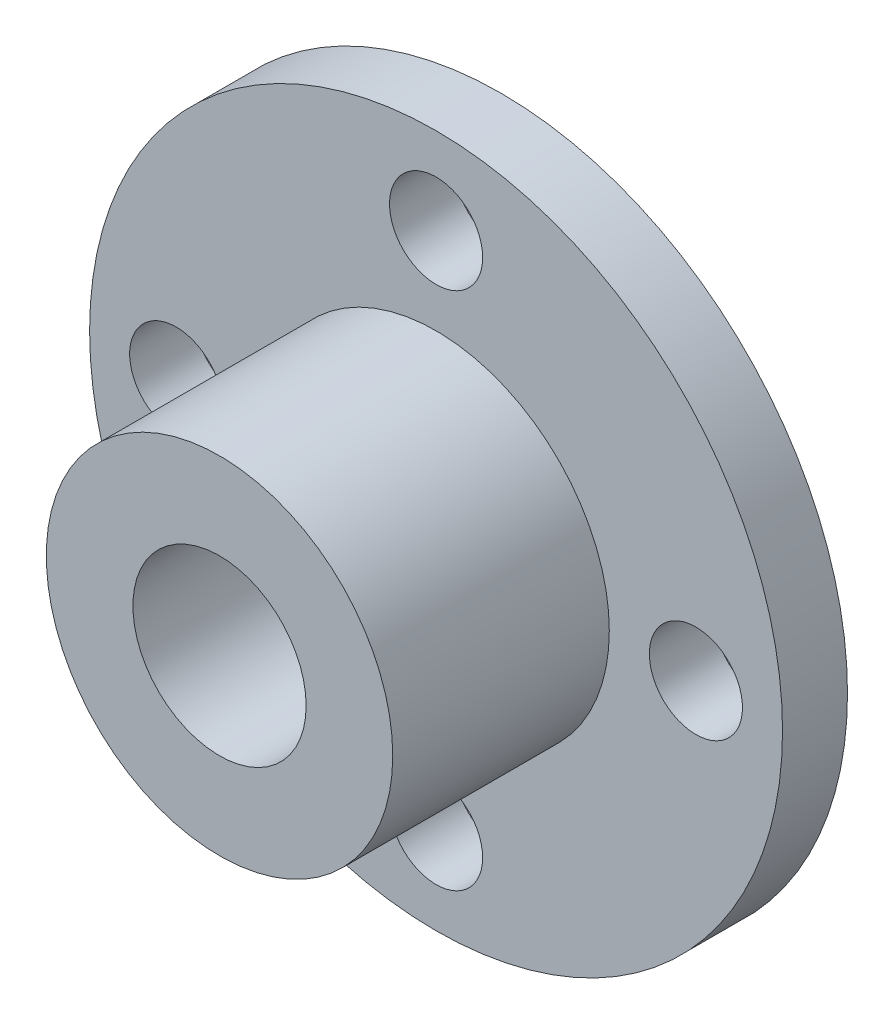
ISO-10303-21;
HEADER;
FILE_DESCRIPTION(('STEP AP214'),'2;1');
FILE_NAME('part.step','',(''),(''),'','','');
FILE_SCHEMA(('AUTOMOTIVE_DESIGN { 1 0 10303 214 1 1 1 1 }'));
ENDSEC;
DATA;
#1=APPLICATION_CONTEXT('core data for automotive mechanical design processes');
#2=APPLICATION_PROTOCOL_DEFINITION('international standard','automotive_design',2000,#1);
#3=PRODUCT_CONTEXT('',#1,'mechanical');
#4=PRODUCT('Part','Part','',(#3));
#5=PRODUCT_RELATED_PRODUCT_CATEGORY('part','',(#4));
#6=PRODUCT_DEFINITION_FORMATION('','',#4);
#7=PRODUCT_DEFINITION_CONTEXT('part definition',#1,'design');
#8=PRODUCT_DEFINITION('design','',#6,#7);
#9=PRODUCT_DEFINITION_SHAPE('','',#8);
#10=(LENGTH_UNIT() NAMED_UNIT(*) SI_UNIT(.MILLI.,.METRE.));
#11=(NAMED_UNIT(*) PLANE_ANGLE_UNIT() SI_UNIT($,.RADIAN.));
#12=(NAMED_UNIT(*) SI_UNIT($,.STERADIAN.) SOLID_ANGLE_UNIT());
#13=UNCERTAINTY_MEASURE_WITH_UNIT(LENGTH_MEASURE(1.E-05),#10,'distance_accuracy_value','');
#14=(GEOMETRIC_REPRESENTATION_CONTEXT(3) GLOBAL_UNCERTAINTY_ASSIGNED_CONTEXT((#13)) GLOBAL_UNIT_ASSIGNED_CONTEXT((#10,
#11,#12)) REPRESENTATION_CONTEXT('',''));
#15=CARTESIAN_POINT('',(0.,0.,0.));
#16=DIRECTION('',(0.,0.,1.));
#17=DIRECTION('',(1.,0.,0.));
#18=AXIS2_PLACEMENT_3D('',#15,#16,#17);
#19=CARTESIAN_POINT('',(0.,12.,3.));
#20=DIRECTION('',(0.,0.,-1.));
#21=DIRECTION('',(-1.,0.,0.));
#22=AXIS2_PLACEMENT_3D('',#19,#20,#21);
#23=CYLINDRICAL_SURFACE('',#22,2.15);
#24=CARTESIAN_POINT('',(0.,12.,3.));
#25=DIRECTION('',(0.,0.,1.));
#26=DIRECTION('',(1.,0.,0.));
#27=AXIS2_PLACEMENT_3D('',#24,#25,#26);
#28=CIRCLE('',#27,2.15);
#29=CARTESIAN_POINT('',(2.15,12.,3.));
#30=VERTEX_POINT('',#29);
#31=EDGE_CURVE('E44',#30,#30,#28,.T.);
#32=ORIENTED_EDGE('',*,*,#31,.T.);
#33=EDGE_LOOP('',(#32));
#34=FACE_BOUND('',#33,.T.);
#35=CARTESIAN_POINT('',(0.,12.,0.));
#36=DIRECTION('',(0.,0.,1.));
#37=DIRECTION('',(1.,0.,0.));
#38=AXIS2_PLACEMENT_3D('',#35,#36,#37);
#39=CIRCLE('',#38,2.15);
#40=CARTESIAN_POINT('',(2.15,12.,0.));
#41=VERTEX_POINT('',#40);
#42=EDGE_CURVE('E63',#41,#41,#39,.T.);
#43=ORIENTED_EDGE('',*,*,#42,.F.);
#44=EDGE_LOOP('',(#43));
#45=FACE_BOUND('',#44,.T.);
#46=ADVANCED_FACE('F33',(#34,#45),#23,.F.);
#47=CARTESIAN_POINT('',(0.,-12.,3.));
#48=DIRECTION('',(0.,0.,-1.));
#49=DIRECTION('',(-1.,0.,0.));
#50=AXIS2_PLACEMENT_3D('',#47,#48,#49);
#51=CYLINDRICAL_SURFACE('',#50,2.15);
#52=CARTESIAN_POINT('',(0.,-12.,3.));
#53=DIRECTION('',(0.,0.,1.));
#54=DIRECTION('',(1.,0.,0.));
#55=AXIS2_PLACEMENT_3D('',#52,#53,#54);
#56=CIRCLE('',#55,2.15);
#57=CARTESIAN_POINT('',(2.15,-12.,3.));
#58=VERTEX_POINT('',#57);
#59=EDGE_CURVE('E49',#58,#58,#56,.T.);
#60=ORIENTED_EDGE('',*,*,#59,.T.);
#61=EDGE_LOOP('',(#60));
#62=FACE_BOUND('',#61,.T.);
#63=CARTESIAN_POINT('',(0.,-12.,0.));
#64=DIRECTION('',(0.,0.,1.));
#65=DIRECTION('',(1.,0.,0.));
#66=AXIS2_PLACEMENT_3D('',#63,#64,#65);
#67=CIRCLE('',#66,2.15);
#68=CARTESIAN_POINT('',(2.15,-12.,0.));
#69=VERTEX_POINT('',#68);
#70=EDGE_CURVE('E60',#69,#69,#67,.T.);
#71=ORIENTED_EDGE('',*,*,#70,.F.);
#72=EDGE_LOOP('',(#71));
#73=FACE_BOUND('',#72,.T.);
#74=ADVANCED_FACE('F83',(#62,#73),#51,.F.);
#75=CARTESIAN_POINT('',(-12.,0.,3.));
#76=DIRECTION('',(0.,0.,-1.));
#77=DIRECTION('',(-1.,0.,0.));
#78=AXIS2_PLACEMENT_3D('',#75,#76,#77);
#79=CYLINDRICAL_SURFACE('',#78,2.15);
#80=CARTESIAN_POINT('',(-12.,0.,3.));
#81=DIRECTION('',(0.,0.,1.));
#82=DIRECTION('',(1.,0.,0.));
#83=AXIS2_PLACEMENT_3D('',#80,#81,#82);
#84=CIRCLE('',#83,2.15);
#85=CARTESIAN_POINT('',(-9.85,0.,3.));
#86=VERTEX_POINT('',#85);
#87=EDGE_CURVE('E71',#86,#86,#84,.T.);
#88=ORIENTED_EDGE('',*,*,#87,.T.);
#89=EDGE_LOOP('',(#88));
#90=FACE_BOUND('',#89,.T.);
#91=CARTESIAN_POINT('',(-12.,0.,0.));
#92=DIRECTION('',(0.,0.,1.));
#93=DIRECTION('',(1.,0.,0.));
#94=AXIS2_PLACEMENT_3D('',#91,#92,#93);
#95=CIRCLE('',#94,2.15);
#96=CARTESIAN_POINT('',(-9.85,0.,0.));
#97=VERTEX_POINT('',#96);
#98=EDGE_CURVE('E56',#97,#97,#95,.T.);
#99=ORIENTED_EDGE('',*,*,#98,.F.);
#100=EDGE_LOOP('',(#99));
#101=FACE_BOUND('',#100,.T.);
#102=ADVANCED_FACE('F119',(#90,#101),#79,.F.);
#103=CARTESIAN_POINT('',(12.,0.,3.));
#104=DIRECTION('',(0.,0.,-1.));
#105=DIRECTION('',(-1.,0.,0.));
#106=AXIS2_PLACEMENT_3D('',#103,#104,#105);
#107=CYLINDRICAL_SURFACE('',#106,2.15);
#108=CARTESIAN_POINT('',(12.,0.,3.));
#109=DIRECTION('',(0.,0.,1.));
#110=DIRECTION('',(1.,0.,0.));
#111=AXIS2_PLACEMENT_3D('',#108,#109,#110);
#112=CIRCLE('',#111,2.15);
#113=CARTESIAN_POINT('',(14.15,0.,3.));
#114=VERTEX_POINT('',#113);
#115=EDGE_CURVE('E67',#114,#114,#112,.T.);
#116=ORIENTED_EDGE('',*,*,#115,.T.);
#117=EDGE_LOOP('',(#116));
#118=FACE_BOUND('',#117,.T.);
#119=CARTESIAN_POINT('',(12.,0.,0.));
#120=DIRECTION('',(0.,0.,1.));
#121=DIRECTION('',(1.,0.,0.));
#122=AXIS2_PLACEMENT_3D('',#119,#120,#121);
#123=CIRCLE('',#122,2.15);
#124=CARTESIAN_POINT('',(14.15,0.,0.));
#125=VERTEX_POINT('',#124);
#126=EDGE_CURVE('E53',#125,#125,#123,.T.);
#127=ORIENTED_EDGE('',*,*,#126,.F.);
#128=EDGE_LOOP('',(#127));
#129=FACE_BOUND('',#128,.T.);
#130=ADVANCED_FACE('F35',(#118,#129),#107,.F.);
#131=CARTESIAN_POINT('',(0.,0.,3.));
#132=DIRECTION('',(0.,0.,-1.));
#133=DIRECTION('',(-1.,0.,0.));
#134=AXIS2_PLACEMENT_3D('',#131,#132,#133);
#135=CYLINDRICAL_SURFACE('',#134,16.);
#136=CARTESIAN_POINT('',(0.,0.,3.));
#137=DIRECTION('',(0.,0.,1.));
#138=DIRECTION('',(1.,0.,0.));
#139=AXIS2_PLACEMENT_3D('',#136,#137,#138);
#140=CIRCLE('',#139,16.);
#141=CARTESIAN_POINT('',(16.,0.,3.));
#142=VERTEX_POINT('',#141);
#143=EDGE_CURVE('E40',#142,#142,#140,.T.);
#144=ORIENTED_EDGE('',*,*,#143,.F.);
#145=EDGE_LOOP('',(#144));
#146=FACE_BOUND('',#145,.T.);
#147=CARTESIAN_POINT('',(0.,0.,0.));
#148=DIRECTION('',(0.,0.,1.));
#149=DIRECTION('',(1.,0.,0.));
#150=AXIS2_PLACEMENT_3D('',#147,#148,#149);
#151=CIRCLE('',#150,16.);
#152=CARTESIAN_POINT('',(16.,0.,0.));
#153=VERTEX_POINT('',#152);
#154=EDGE_CURVE('E65',#153,#153,#151,.T.);
#155=ORIENTED_EDGE('',*,*,#154,.T.);
#156=EDGE_LOOP('',(#155));
#157=FACE_BOUND('',#156,.T.);
#158=ADVANCED_FACE('F90',(#146,#157),#135,.T.);
#159=CARTESIAN_POINT('',(0.,0.,3.));
#160=DIRECTION('',(0.,0.,1.));
#161=DIRECTION('',(1.,0.,0.));
#162=AXIS2_PLACEMENT_3D('',#159,#160,#161);
#163=PLANE('',#162);
#164=CARTESIAN_POINT('',(0.,0.,3.));
#165=DIRECTION('',(0.,0.,1.));
#166=DIRECTION('',(1.,0.,0.));
#167=AXIS2_PLACEMENT_3D('',#164,#165,#166);
#168=CIRCLE('',#167,8.);
#169=CARTESIAN_POINT('',(8.,0.,3.));
#170=VERTEX_POINT('',#169);
#171=EDGE_CURVE('E78',#170,#170,#168,.T.);
#172=ORIENTED_EDGE('',*,*,#171,.F.);
#173=EDGE_LOOP('',(#172));
#174=FACE_BOUND('',#173,.T.);
#175=ORIENTED_EDGE('',*,*,#115,.F.);
#176=EDGE_LOOP('',(#175));
#177=FACE_BOUND('',#176,.T.);
#178=ORIENTED_EDGE('',*,*,#87,.F.);
#179=EDGE_LOOP('',(#178));
#180=FACE_BOUND('',#179,.T.);
#181=ORIENTED_EDGE('',*,*,#59,.F.);
#182=EDGE_LOOP('',(#181));
#183=FACE_BOUND('',#182,.T.);
#184=ORIENTED_EDGE('',*,*,#31,.F.);
#185=EDGE_LOOP('',(#184));
#186=FACE_BOUND('',#185,.T.);
#187=ORIENTED_EDGE('',*,*,#143,.T.);
#188=EDGE_LOOP('',(#187));
#189=FACE_BOUND('',#188,.T.);
#190=ADVANCED_FACE('F86',(#174,#177,#180,#183,#186,#189),#163,.T.);
#191=CARTESIAN_POINT('',(0.,0.,0.));
#192=DIRECTION('',(0.,0.,1.));
#193=DIRECTION('',(1.,0.,0.));
#194=AXIS2_PLACEMENT_3D('',#191,#192,#193);
#195=PLANE('',#194);
#196=ORIENTED_EDGE('',*,*,#126,.T.);
#197=EDGE_LOOP('',(#196));
#198=FACE_BOUND('',#197,.T.);
#199=ORIENTED_EDGE('',*,*,#98,.T.);
#200=EDGE_LOOP('',(#199));
#201=FACE_BOUND('',#200,.T.);
#202=ORIENTED_EDGE('',*,*,#70,.T.);
#203=EDGE_LOOP('',(#202));
#204=FACE_BOUND('',#203,.T.);
#205=ORIENTED_EDGE('',*,*,#42,.T.);
#206=EDGE_LOOP('',(#205));
#207=FACE_BOUND('',#206,.T.);
#208=ORIENTED_EDGE('',*,*,#154,.F.);
#209=EDGE_LOOP('',(#208));
#210=FACE_BOUND('',#209,.T.);
#211=ADVANCED_FACE('F89',(#198,#201,#204,#207,#210),#195,.F.);
#212=CARTESIAN_POINT('',(0.,0.,13.));
#213=DIRECTION('',(0.,0.,1.));
#214=DIRECTION('',(1.,0.,0.));
#215=AXIS2_PLACEMENT_3D('',#212,#213,#214);
#216=PLANE('',#215);
#217=CARTESIAN_POINT('',(0.,0.,13.));
#218=DIRECTION('',(0.,0.,1.));
#219=DIRECTION('',(1.,0.,0.));
#220=AXIS2_PLACEMENT_3D('',#217,#218,#219);
#221=CIRCLE('',#220,8.);
#222=CARTESIAN_POINT('',(8.,0.,13.));
#223=VERTEX_POINT('',#222);
#224=EDGE_CURVE('E57',#223,#223,#221,.T.);
#225=ORIENTED_EDGE('',*,*,#224,.T.);
#226=EDGE_LOOP('',(#225));
#227=FACE_BOUND('',#226,.T.);
#228=CARTESIAN_POINT('',(0.,0.,13.));
#229=DIRECTION('',(0.,0.,1.));
#230=DIRECTION('',(1.,0.,0.));
#231=AXIS2_PLACEMENT_3D('',#228,#229,#230);
#232=CIRCLE('',#231,4.);
#233=CARTESIAN_POINT('',(4.,0.,13.));
#234=VERTEX_POINT('',#233);
#235=EDGE_CURVE('E185',#234,#234,#232,.T.);
#236=ORIENTED_EDGE('',*,*,#235,.F.);
#237=EDGE_LOOP('',(#236));
#238=FACE_BOUND('',#237,.T.);
#239=ADVANCED_FACE('F103',(#227,#238),#216,.T.);
#240=CARTESIAN_POINT('',(0.,0.,13.));
#241=DIRECTION('',(0.,0.,-1.));
#242=DIRECTION('',(-1.,0.,0.));
#243=AXIS2_PLACEMENT_3D('',#240,#241,#242);
#244=CYLINDRICAL_SURFACE('',#243,8.);
#245=ORIENTED_EDGE('',*,*,#224,.F.);
#246=EDGE_LOOP('',(#245));
#247=FACE_BOUND('',#246,.T.);
#248=ORIENTED_EDGE('',*,*,#171,.T.);
#249=EDGE_LOOP('',(#248));
#250=FACE_BOUND('',#249,.T.);
#251=ADVANCED_FACE('F109',(#247,#250),#244,.T.);
#252=CARTESIAN_POINT('',(0.,0.,13.));
#253=DIRECTION('',(0.,0.,-1.));
#254=DIRECTION('',(-1.,0.,0.));
#255=AXIS2_PLACEMENT_3D('',#252,#253,#254);
#256=CYLINDRICAL_SURFACE('',#255,4.);
#257=ORIENTED_EDGE('',*,*,#235,.T.);
#258=EDGE_LOOP('',(#257));
#259=FACE_BOUND('',#258,.T.);
#260=CARTESIAN_POINT('',(0.,0.,3.));
#261=DIRECTION('',(0.,0.,1.));
#262=DIRECTION('',(1.,0.,0.));
#263=AXIS2_PLACEMENT_3D('',#260,#261,#262);
#264=CIRCLE('',#263,4.);
#265=CARTESIAN_POINT('',(4.,0.,3.));
#266=VERTEX_POINT('',#265);
#267=EDGE_CURVE('E10',#266,#266,#264,.F.);
#268=ORIENTED_EDGE('',*,*,#267,.T.);
#269=EDGE_LOOP('',(#268));
#270=FACE_BOUND('',#269,.T.);
#271=ADVANCED_FACE('F161',(#259,#270),#256,.F.);
#272=ORIENTED_EDGE('',*,*,#267,.F.);
#273=EDGE_LOOP('',(#272));
#274=FACE_BOUND('',#273,.T.);
#275=ADVANCED_FACE('F93',(#274),#163,.T.);
#276=CLOSED_SHELL('',(#46,#74,#102,#130,#158,#190,#211,#239,#251,#271,#275));
#277=MANIFOLD_SOLID_BREP('B2',#276);
#278=ADVANCED_BREP_SHAPE_REPRESENTATION('',(#18,#277),#14);
#279=SHAPE_DEFINITION_REPRESENTATION(#9,#278);
ENDSEC;
END-ISO-10303-21;
